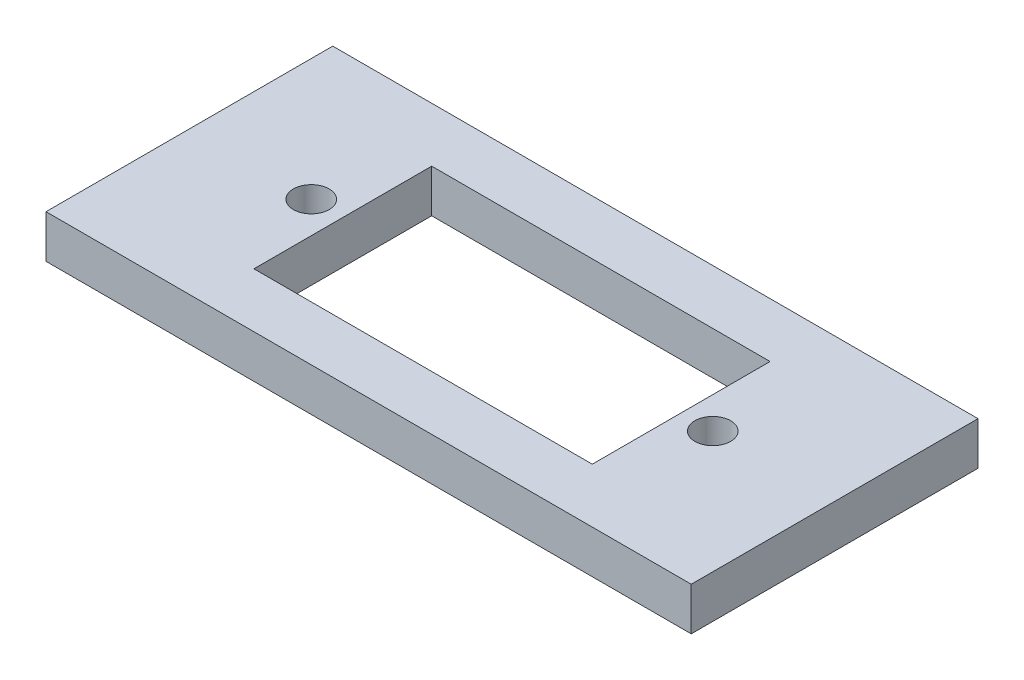
ISO-10303-21;
HEADER;
FILE_DESCRIPTION(('STEP AP214'),'2;1');
FILE_NAME('part.step','',(''),(''),'','','');
FILE_SCHEMA(('AUTOMOTIVE_DESIGN { 1 0 10303 214 1 1 1 1 }'));
ENDSEC;
DATA;
#1=APPLICATION_CONTEXT('core data for automotive mechanical design processes');
#2=APPLICATION_PROTOCOL_DEFINITION('international standard','automotive_design',2000,#1);
#3=PRODUCT_CONTEXT('',#1,'mechanical');
#4=PRODUCT('Part','Part','',(#3));
#5=PRODUCT_RELATED_PRODUCT_CATEGORY('part','',(#4));
#6=PRODUCT_DEFINITION_FORMATION('','',#4);
#7=PRODUCT_DEFINITION_CONTEXT('part definition',#1,'design');
#8=PRODUCT_DEFINITION('design','',#6,#7);
#9=PRODUCT_DEFINITION_SHAPE('','',#8);
#10=(LENGTH_UNIT() NAMED_UNIT(*) SI_UNIT(.MILLI.,.METRE.));
#11=(NAMED_UNIT(*) PLANE_ANGLE_UNIT() SI_UNIT($,.RADIAN.));
#12=(NAMED_UNIT(*) SI_UNIT($,.STERADIAN.) SOLID_ANGLE_UNIT());
#13=UNCERTAINTY_MEASURE_WITH_UNIT(LENGTH_MEASURE(1.E-05),#10,'distance_accuracy_value','');
#14=(GEOMETRIC_REPRESENTATION_CONTEXT(3) GLOBAL_UNCERTAINTY_ASSIGNED_CONTEXT((#13)) GLOBAL_UNIT_ASSIGNED_CONTEXT((#10,
#11,#12)) REPRESENTATION_CONTEXT('',''));
#15=CARTESIAN_POINT('',(0.,0.,0.));
#16=DIRECTION('',(0.,0.,1.));
#17=DIRECTION('',(1.,0.,0.));
#18=AXIS2_PLACEMENT_3D('',#15,#16,#17);
#19=CARTESIAN_POINT('',(0.,3.,0.));
#20=DIRECTION('',(0.,1.,0.));
#21=DIRECTION('',(0.,0.,1.));
#22=AXIS2_PLACEMENT_3D('',#19,#20,#21);
#23=PLANE('',#22);
#24=CARTESIAN_POINT('',(14.,3.,0.));
#25=DIRECTION('',(0.,1.,0.));
#26=DIRECTION('',(0.,0.,1.));
#27=AXIS2_PLACEMENT_3D('',#24,#25,#26);
#28=CIRCLE('',#27,1.25);
#29=CARTESIAN_POINT('',(14.,3.,1.24999999999998));
#30=VERTEX_POINT('',#29);
#31=EDGE_CURVE('E139',#30,#30,#28,.T.);
#32=ORIENTED_EDGE('',*,*,#31,.F.);
#33=EDGE_LOOP('',(#32));
#34=FACE_BOUND('',#33,.T.);
#35=DIRECTION('',(0.,0.,-1.));
#36=VECTOR('',#35,1.);
#37=CARTESIAN_POINT('',(22.5,3.,-10.));
#38=LINE('',#37,#36);
#39=CARTESIAN_POINT('',(22.5,3.,10.));
#40=VERTEX_POINT('',#39);
#41=CARTESIAN_POINT('',(22.5,3.,-10.));
#42=VERTEX_POINT('',#41);
#43=EDGE_CURVE('E149',#40,#42,#38,.T.);
#44=ORIENTED_EDGE('',*,*,#43,.T.);
#45=DIRECTION('',(-1.,0.,0.));
#46=VECTOR('',#45,1.);
#47=CARTESIAN_POINT('',(-22.5,3.,-10.));
#48=LINE('',#47,#46);
#49=CARTESIAN_POINT('',(-22.5,3.,-10.));
#50=VERTEX_POINT('',#49);
#51=EDGE_CURVE('E152',#42,#50,#48,.T.);
#52=ORIENTED_EDGE('',*,*,#51,.T.);
#53=DIRECTION('',(0.,0.,1.));
#54=VECTOR('',#53,1.);
#55=CARTESIAN_POINT('',(-22.5,3.,-10.));
#56=LINE('',#55,#54);
#57=CARTESIAN_POINT('',(-22.5,3.,10.));
#58=VERTEX_POINT('',#57);
#59=EDGE_CURVE('E155',#50,#58,#56,.T.);
#60=ORIENTED_EDGE('',*,*,#59,.T.);
#61=DIRECTION('',(1.,0.,0.));
#62=VECTOR('',#61,1.);
#63=CARTESIAN_POINT('',(-22.5,3.,10.));
#64=LINE('',#63,#62);
#65=EDGE_CURVE('E157',#58,#40,#64,.T.);
#66=ORIENTED_EDGE('',*,*,#65,.T.);
#67=EDGE_LOOP('',(#44,#52,#60,#66));
#68=FACE_BOUND('',#67,.T.);
#69=DIRECTION('',(-1.,0.,0.));
#70=VECTOR('',#69,1.);
#71=CARTESIAN_POINT('',(-11.8,3.,-6.2));
#72=LINE('',#71,#70);
#73=CARTESIAN_POINT('',(11.8,3.,-6.2));
#74=VERTEX_POINT('',#73);
#75=CARTESIAN_POINT('',(-11.8,3.,-6.2));
#76=VERTEX_POINT('',#75);
#77=EDGE_CURVE('E118',#74,#76,#72,.T.);
#78=ORIENTED_EDGE('',*,*,#77,.F.);
#79=DIRECTION('',(0.,0.,-1.));
#80=VECTOR('',#79,1.);
#81=CARTESIAN_POINT('',(11.8,3.,-6.2));
#82=LINE('',#81,#80);
#83=CARTESIAN_POINT('',(11.8,3.,6.2));
#84=VERTEX_POINT('',#83);
#85=EDGE_CURVE('E110',#84,#74,#82,.T.);
#86=ORIENTED_EDGE('',*,*,#85,.F.);
#87=DIRECTION('',(1.,0.,0.));
#88=VECTOR('',#87,1.);
#89=CARTESIAN_POINT('',(-11.8,3.,6.2));
#90=LINE('',#89,#88);
#91=CARTESIAN_POINT('',(-11.8,3.,6.2));
#92=VERTEX_POINT('',#91);
#93=EDGE_CURVE('E133',#92,#84,#90,.T.);
#94=ORIENTED_EDGE('',*,*,#93,.F.);
#95=DIRECTION('',(0.,0.,1.));
#96=VECTOR('',#95,1.);
#97=CARTESIAN_POINT('',(-11.8,3.,-6.2));
#98=LINE('',#97,#96);
#99=EDGE_CURVE('E131',#76,#92,#98,.T.);
#100=ORIENTED_EDGE('',*,*,#99,.F.);
#101=EDGE_LOOP('',(#78,#86,#94,#100));
#102=FACE_BOUND('',#101,.T.);
#103=CARTESIAN_POINT('',(-14.,3.,0.));
#104=DIRECTION('',(0.,1.,0.));
#105=DIRECTION('',(0.,0.,1.));
#106=AXIS2_PLACEMENT_3D('',#103,#104,#105);
#107=CIRCLE('',#106,1.25);
#108=CARTESIAN_POINT('',(-14.,3.,1.24999999999998));
#109=VERTEX_POINT('',#108);
#110=EDGE_CURVE('E239',#109,#109,#107,.T.);
#111=ORIENTED_EDGE('',*,*,#110,.F.);
#112=EDGE_LOOP('',(#111));
#113=FACE_BOUND('',#112,.T.);
#114=ADVANCED_FACE('F45',(#34,#68,#102,#113),#23,.T.);
#115=CARTESIAN_POINT('',(0.,0.,0.));
#116=DIRECTION('',(0.,1.,0.));
#117=DIRECTION('',(0.,0.,1.));
#118=AXIS2_PLACEMENT_3D('',#115,#116,#117);
#119=PLANE('',#118);
#120=DIRECTION('',(0.,0.,-1.));
#121=VECTOR('',#120,1.);
#122=CARTESIAN_POINT('',(22.5,0.,-10.));
#123=LINE('',#122,#121);
#124=CARTESIAN_POINT('',(22.5,0.,10.));
#125=VERTEX_POINT('',#124);
#126=CARTESIAN_POINT('',(22.5,0.,-10.));
#127=VERTEX_POINT('',#126);
#128=EDGE_CURVE('E126',#125,#127,#123,.T.);
#129=ORIENTED_EDGE('',*,*,#128,.F.);
#130=DIRECTION('',(1.,0.,0.));
#131=VECTOR('',#130,1.);
#132=CARTESIAN_POINT('',(-22.5,0.,10.));
#133=LINE('',#132,#131);
#134=CARTESIAN_POINT('',(-22.5,0.,10.));
#135=VERTEX_POINT('',#134);
#136=EDGE_CURVE('E153',#135,#125,#133,.T.);
#137=ORIENTED_EDGE('',*,*,#136,.F.);
#138=DIRECTION('',(0.,0.,1.));
#139=VECTOR('',#138,1.);
#140=CARTESIAN_POINT('',(-22.5,0.,-10.));
#141=LINE('',#140,#139);
#142=CARTESIAN_POINT('',(-22.5,0.,-10.));
#143=VERTEX_POINT('',#142);
#144=EDGE_CURVE('E164',#143,#135,#141,.T.);
#145=ORIENTED_EDGE('',*,*,#144,.F.);
#146=DIRECTION('',(-1.,0.,0.));
#147=VECTOR('',#146,1.);
#148=CARTESIAN_POINT('',(-22.5,0.,-10.));
#149=LINE('',#148,#147);
#150=EDGE_CURVE('E162',#127,#143,#149,.T.);
#151=ORIENTED_EDGE('',*,*,#150,.F.);
#152=EDGE_LOOP('',(#129,#137,#145,#151));
#153=FACE_BOUND('',#152,.T.);
#154=DIRECTION('',(0.,0.,-1.));
#155=VECTOR('',#154,1.);
#156=CARTESIAN_POINT('',(11.8,0.,-6.2));
#157=LINE('',#156,#155);
#158=CARTESIAN_POINT('',(11.8,0.,6.2));
#159=VERTEX_POINT('',#158);
#160=CARTESIAN_POINT('',(11.8,0.,-6.2));
#161=VERTEX_POINT('',#160);
#162=EDGE_CURVE('E68',#159,#161,#157,.T.);
#163=ORIENTED_EDGE('',*,*,#162,.T.);
#164=DIRECTION('',(-1.,0.,0.));
#165=VECTOR('',#164,1.);
#166=CARTESIAN_POINT('',(-11.8,0.,-6.2));
#167=LINE('',#166,#165);
#168=CARTESIAN_POINT('',(-11.8,0.,-6.2));
#169=VERTEX_POINT('',#168);
#170=EDGE_CURVE('E125',#161,#169,#167,.T.);
#171=ORIENTED_EDGE('',*,*,#170,.T.);
#172=DIRECTION('',(0.,0.,1.));
#173=VECTOR('',#172,1.);
#174=CARTESIAN_POINT('',(-11.8,0.,-6.2));
#175=LINE('',#174,#173);
#176=CARTESIAN_POINT('',(-11.8,0.,6.2));
#177=VERTEX_POINT('',#176);
#178=EDGE_CURVE('E141',#169,#177,#175,.T.);
#179=ORIENTED_EDGE('',*,*,#178,.T.);
#180=DIRECTION('',(1.,0.,0.));
#181=VECTOR('',#180,1.);
#182=CARTESIAN_POINT('',(-11.8,0.,6.2));
#183=LINE('',#182,#181);
#184=EDGE_CURVE('E119',#177,#159,#183,.T.);
#185=ORIENTED_EDGE('',*,*,#184,.T.);
#186=EDGE_LOOP('',(#163,#171,#179,#185));
#187=FACE_BOUND('',#186,.T.);
#188=CARTESIAN_POINT('',(14.,0.,0.));
#189=DIRECTION('',(0.,1.,0.));
#190=DIRECTION('',(0.,0.,1.));
#191=AXIS2_PLACEMENT_3D('',#188,#189,#190);
#192=CIRCLE('',#191,1.25);
#193=CARTESIAN_POINT('',(14.,0.,1.24999999999998));
#194=VERTEX_POINT('',#193);
#195=EDGE_CURVE('E245',#194,#194,#192,.T.);
#196=ORIENTED_EDGE('',*,*,#195,.T.);
#197=EDGE_LOOP('',(#196));
#198=FACE_BOUND('',#197,.T.);
#199=CARTESIAN_POINT('',(-14.,0.,0.));
#200=DIRECTION('',(0.,1.,0.));
#201=DIRECTION('',(0.,0.,1.));
#202=AXIS2_PLACEMENT_3D('',#199,#200,#201);
#203=CIRCLE('',#202,1.25);
#204=CARTESIAN_POINT('',(-14.,0.,1.24999999999998));
#205=VERTEX_POINT('',#204);
#206=EDGE_CURVE('E242',#205,#205,#203,.T.);
#207=ORIENTED_EDGE('',*,*,#206,.T.);
#208=EDGE_LOOP('',(#207));
#209=FACE_BOUND('',#208,.T.);
#210=ADVANCED_FACE('F182',(#153,#187,#198,#209),#119,.F.);
#211=CARTESIAN_POINT('',(22.5,3.,-10.));
#212=DIRECTION('',(-1.,0.,0.));
#213=DIRECTION('',(0.,0.,1.));
#214=AXIS2_PLACEMENT_3D('',#211,#212,#213);
#215=PLANE('',#214);
#216=ORIENTED_EDGE('',*,*,#128,.T.);
#217=DIRECTION('',(0.,-1.,0.));
#218=VECTOR('',#217,1.);
#219=CARTESIAN_POINT('',(22.5,3.,-10.));
#220=LINE('',#219,#218);
#221=EDGE_CURVE('E11',#42,#127,#220,.T.);
#222=ORIENTED_EDGE('',*,*,#221,.F.);
#223=ORIENTED_EDGE('',*,*,#43,.F.);
#224=DIRECTION('',(0.,-1.,0.));
#225=VECTOR('',#224,1.);
#226=CARTESIAN_POINT('',(22.5,3.,10.));
#227=LINE('',#226,#225);
#228=EDGE_CURVE('E159',#40,#125,#227,.T.);
#229=ORIENTED_EDGE('',*,*,#228,.T.);
#230=EDGE_LOOP('',(#216,#222,#223,#229));
#231=FACE_BOUND('',#230,.T.);
#232=ADVANCED_FACE('F47',(#231),#215,.F.);
#233=CARTESIAN_POINT('',(-22.5,3.,-10.));
#234=DIRECTION('',(0.,0.,1.));
#235=DIRECTION('',(1.,0.,0.));
#236=AXIS2_PLACEMENT_3D('',#233,#234,#235);
#237=PLANE('',#236);
#238=ORIENTED_EDGE('',*,*,#150,.T.);
#239=DIRECTION('',(0.,-1.,0.));
#240=VECTOR('',#239,1.);
#241=CARTESIAN_POINT('',(-22.5,3.,-10.));
#242=LINE('',#241,#240);
#243=EDGE_CURVE('E53',#50,#143,#242,.T.);
#244=ORIENTED_EDGE('',*,*,#243,.F.);
#245=ORIENTED_EDGE('',*,*,#51,.F.);
#246=ORIENTED_EDGE('',*,*,#221,.T.);
#247=EDGE_LOOP('',(#238,#244,#245,#246));
#248=FACE_BOUND('',#247,.T.);
#249=ADVANCED_FACE('F192',(#248),#237,.F.);
#250=CARTESIAN_POINT('',(-22.5,3.,-10.));
#251=DIRECTION('',(1.,0.,0.));
#252=DIRECTION('',(0.,0.,-1.));
#253=AXIS2_PLACEMENT_3D('',#250,#251,#252);
#254=PLANE('',#253);
#255=ORIENTED_EDGE('',*,*,#144,.T.);
#256=DIRECTION('',(0.,-1.,0.));
#257=VECTOR('',#256,1.);
#258=CARTESIAN_POINT('',(-22.5,3.,10.));
#259=LINE('',#258,#257);
#260=EDGE_CURVE('E169',#58,#135,#259,.T.);
#261=ORIENTED_EDGE('',*,*,#260,.F.);
#262=ORIENTED_EDGE('',*,*,#59,.F.);
#263=ORIENTED_EDGE('',*,*,#243,.T.);
#264=EDGE_LOOP('',(#255,#261,#262,#263));
#265=FACE_BOUND('',#264,.T.);
#266=ADVANCED_FACE('F176',(#265),#254,.F.);
#267=CARTESIAN_POINT('',(-22.5,3.,10.));
#268=DIRECTION('',(0.,0.,-1.));
#269=DIRECTION('',(-1.,0.,0.));
#270=AXIS2_PLACEMENT_3D('',#267,#268,#269);
#271=PLANE('',#270);
#272=ORIENTED_EDGE('',*,*,#136,.T.);
#273=ORIENTED_EDGE('',*,*,#228,.F.);
#274=ORIENTED_EDGE('',*,*,#65,.F.);
#275=ORIENTED_EDGE('',*,*,#260,.T.);
#276=EDGE_LOOP('',(#272,#273,#274,#275));
#277=FACE_BOUND('',#276,.T.);
#278=ADVANCED_FACE('F186',(#277),#271,.F.);
#279=CARTESIAN_POINT('',(11.8,3.,-6.2));
#280=DIRECTION('',(-1.,0.,0.));
#281=DIRECTION('',(0.,0.,1.));
#282=AXIS2_PLACEMENT_3D('',#279,#280,#281);
#283=PLANE('',#282);
#284=ORIENTED_EDGE('',*,*,#162,.F.);
#285=DIRECTION('',(0.,-1.,0.));
#286=VECTOR('',#285,1.);
#287=CARTESIAN_POINT('',(11.8,3.,6.2));
#288=LINE('',#287,#286);
#289=EDGE_CURVE('E114',#84,#159,#288,.T.);
#290=ORIENTED_EDGE('',*,*,#289,.F.);
#291=ORIENTED_EDGE('',*,*,#85,.T.);
#292=DIRECTION('',(0.,-1.,0.));
#293=VECTOR('',#292,1.);
#294=CARTESIAN_POINT('',(11.8,3.,-6.2));
#295=LINE('',#294,#293);
#296=EDGE_CURVE('E113',#74,#161,#295,.T.);
#297=ORIENTED_EDGE('',*,*,#296,.T.);
#298=EDGE_LOOP('',(#284,#290,#291,#297));
#299=FACE_BOUND('',#298,.T.);
#300=ADVANCED_FACE('F112',(#299),#283,.T.);
#301=CARTESIAN_POINT('',(-11.8,3.,-6.2));
#302=DIRECTION('',(0.,0.,1.));
#303=DIRECTION('',(1.,0.,0.));
#304=AXIS2_PLACEMENT_3D('',#301,#302,#303);
#305=PLANE('',#304);
#306=ORIENTED_EDGE('',*,*,#170,.F.);
#307=ORIENTED_EDGE('',*,*,#296,.F.);
#308=ORIENTED_EDGE('',*,*,#77,.T.);
#309=DIRECTION('',(0.,-1.,0.));
#310=VECTOR('',#309,1.);
#311=CARTESIAN_POINT('',(-11.8,3.,-6.2));
#312=LINE('',#311,#310);
#313=EDGE_CURVE('E127',#76,#169,#312,.T.);
#314=ORIENTED_EDGE('',*,*,#313,.T.);
#315=EDGE_LOOP('',(#306,#307,#308,#314));
#316=FACE_BOUND('',#315,.T.);
#317=ADVANCED_FACE('F122',(#316),#305,.T.);
#318=CARTESIAN_POINT('',(-11.8,3.,-6.2));
#319=DIRECTION('',(1.,0.,0.));
#320=DIRECTION('',(0.,0.,-1.));
#321=AXIS2_PLACEMENT_3D('',#318,#319,#320);
#322=PLANE('',#321);
#323=ORIENTED_EDGE('',*,*,#178,.F.);
#324=ORIENTED_EDGE('',*,*,#313,.F.);
#325=ORIENTED_EDGE('',*,*,#99,.T.);
#326=DIRECTION('',(0.,-1.,0.));
#327=VECTOR('',#326,1.);
#328=CARTESIAN_POINT('',(-11.8,3.,6.2));
#329=LINE('',#328,#327);
#330=EDGE_CURVE('E60',#92,#177,#329,.T.);
#331=ORIENTED_EDGE('',*,*,#330,.T.);
#332=EDGE_LOOP('',(#323,#324,#325,#331));
#333=FACE_BOUND('',#332,.T.);
#334=ADVANCED_FACE('F217',(#333),#322,.T.);
#335=CARTESIAN_POINT('',(-11.8,3.,6.2));
#336=DIRECTION('',(0.,0.,-1.));
#337=DIRECTION('',(-1.,0.,0.));
#338=AXIS2_PLACEMENT_3D('',#335,#336,#337);
#339=PLANE('',#338);
#340=ORIENTED_EDGE('',*,*,#184,.F.);
#341=ORIENTED_EDGE('',*,*,#330,.F.);
#342=ORIENTED_EDGE('',*,*,#93,.T.);
#343=ORIENTED_EDGE('',*,*,#289,.T.);
#344=EDGE_LOOP('',(#340,#341,#342,#343));
#345=FACE_BOUND('',#344,.T.);
#346=ADVANCED_FACE('F221',(#345),#339,.T.);
#347=CARTESIAN_POINT('',(14.,3.,0.));
#348=DIRECTION('',(0.,-1.,0.));
#349=DIRECTION('',(0.,0.,-1.));
#350=AXIS2_PLACEMENT_3D('',#347,#348,#349);
#351=CYLINDRICAL_SURFACE('',#350,1.25);
#352=ORIENTED_EDGE('',*,*,#31,.T.);
#353=EDGE_LOOP('',(#352));
#354=FACE_BOUND('',#353,.T.);
#355=ORIENTED_EDGE('',*,*,#195,.F.);
#356=EDGE_LOOP('',(#355));
#357=FACE_BOUND('',#356,.T.);
#358=ADVANCED_FACE('F227',(#354,#357),#351,.F.);
#359=CARTESIAN_POINT('',(-14.,3.,0.));
#360=DIRECTION('',(0.,-1.,0.));
#361=DIRECTION('',(0.,0.,-1.));
#362=AXIS2_PLACEMENT_3D('',#359,#360,#361);
#363=CYLINDRICAL_SURFACE('',#362,1.25);
#364=ORIENTED_EDGE('',*,*,#110,.T.);
#365=EDGE_LOOP('',(#364));
#366=FACE_BOUND('',#365,.T.);
#367=ORIENTED_EDGE('',*,*,#206,.F.);
#368=EDGE_LOOP('',(#367));
#369=FACE_BOUND('',#368,.T.);
#370=ADVANCED_FACE('F230',(#366,#369),#363,.F.);
#371=CLOSED_SHELL('',(#114,#210,#232,#249,#266,#278,#300,#317,#334,#346,#358,#370));
#372=MANIFOLD_SOLID_BREP('B2',#371);
#373=ADVANCED_BREP_SHAPE_REPRESENTATION('',(#18,#372),#14);
#374=SHAPE_DEFINITION_REPRESENTATION(#9,#373);
ENDSEC;
END-ISO-10303-21;
